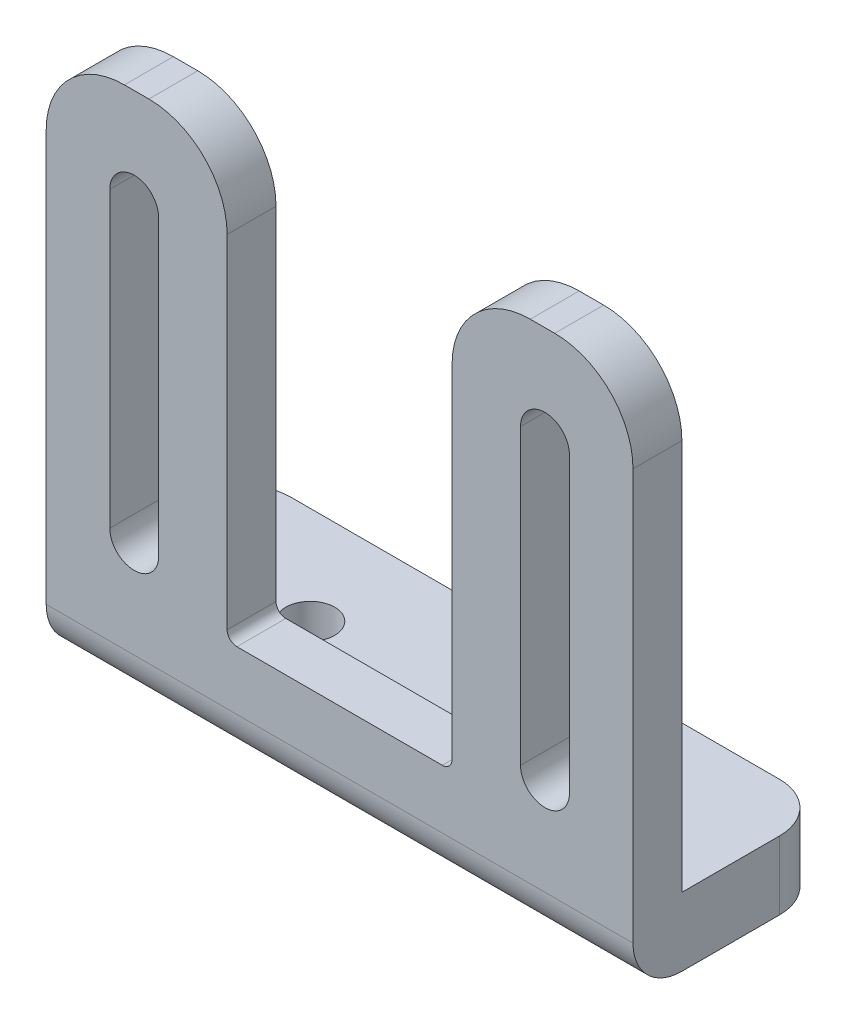
ISO-10303-21;
HEADER;
FILE_DESCRIPTION(('STEP AP214'),'2;1');
FILE_NAME('part.step','',(''),(''),'','','');
FILE_SCHEMA(('AUTOMOTIVE_DESIGN { 1 0 10303 214 1 1 1 1 }'));
ENDSEC;
DATA;
#1=APPLICATION_CONTEXT('core data for automotive mechanical design processes');
#2=APPLICATION_PROTOCOL_DEFINITION('international standard','automotive_design',2000,#1);
#3=PRODUCT_CONTEXT('',#1,'mechanical');
#4=PRODUCT('Part','Part','',(#3));
#5=PRODUCT_RELATED_PRODUCT_CATEGORY('part','',(#4));
#6=PRODUCT_DEFINITION_FORMATION('','',#4);
#7=PRODUCT_DEFINITION_CONTEXT('part definition',#1,'design');
#8=PRODUCT_DEFINITION('design','',#6,#7);
#9=PRODUCT_DEFINITION_SHAPE('','',#8);
#10=(LENGTH_UNIT() NAMED_UNIT(*) SI_UNIT(.MILLI.,.METRE.));
#11=(NAMED_UNIT(*) PLANE_ANGLE_UNIT() SI_UNIT($,.RADIAN.));
#12=(NAMED_UNIT(*) SI_UNIT($,.STERADIAN.) SOLID_ANGLE_UNIT());
#13=UNCERTAINTY_MEASURE_WITH_UNIT(LENGTH_MEASURE(1.E-05),#10,'distance_accuracy_value','');
#14=(GEOMETRIC_REPRESENTATION_CONTEXT(3) GLOBAL_UNCERTAINTY_ASSIGNED_CONTEXT((#13)) GLOBAL_UNIT_ASSIGNED_CONTEXT((#10,
#11,#12)) REPRESENTATION_CONTEXT('',''));
#15=CARTESIAN_POINT('',(0.,0.,0.));
#16=DIRECTION('',(0.,0.,1.));
#17=DIRECTION('',(1.,0.,0.));
#18=AXIS2_PLACEMENT_3D('',#15,#16,#17);
#19=CARTESIAN_POINT('',(0.,55.,5.));
#20=DIRECTION('',(0.,-1.,0.));
#21=DIRECTION('',(0.,0.,-1.));
#22=AXIS2_PLACEMENT_3D('',#19,#20,#21);
#23=PLANE('',#22);
#24=DIRECTION('',(-1.,0.,0.));
#25=VECTOR('',#24,1.);
#26=CARTESIAN_POINT('',(0.,55.,5.));
#27=LINE('',#26,#25);
#28=CARTESIAN_POINT('',(10.5,55.,5.));
#29=VERTEX_POINT('',#28);
#30=CARTESIAN_POINT('',(8.,55.,5.));
#31=VERTEX_POINT('',#30);
#32=EDGE_CURVE('E384',#29,#31,#27,.T.);
#33=ORIENTED_EDGE('',*,*,#32,.F.);
#34=DIRECTION('',(0.,0.,1.));
#35=VECTOR('',#34,1.);
#36=CARTESIAN_POINT('',(10.5,55.,5.));
#37=LINE('',#36,#35);
#38=CARTESIAN_POINT('',(10.5,55.,0.));
#39=VERTEX_POINT('',#38);
#40=EDGE_CURVE('E443',#29,#39,#37,.F.);
#41=ORIENTED_EDGE('',*,*,#40,.T.);
#42=DIRECTION('',(-1.,0.,0.));
#43=VECTOR('',#42,1.);
#44=CARTESIAN_POINT('',(0.,55.,0.));
#45=LINE('',#44,#43);
#46=CARTESIAN_POINT('',(8.,55.,0.));
#47=VERTEX_POINT('',#46);
#48=EDGE_CURVE('E246',#39,#47,#45,.T.);
#49=ORIENTED_EDGE('',*,*,#48,.T.);
#50=DIRECTION('',(0.,0.,-1.));
#51=VECTOR('',#50,1.);
#52=CARTESIAN_POINT('',(8.,55.,5.));
#53=LINE('',#52,#51);
#54=EDGE_CURVE('E440',#47,#31,#53,.F.);
#55=ORIENTED_EDGE('',*,*,#54,.T.);
#56=EDGE_LOOP('',(#33,#41,#49,#55));
#57=FACE_BOUND('',#56,.T.);
#58=ADVANCED_FACE('F43',(#57),#23,.F.);
#59=CARTESIAN_POINT('',(0.,0.,5.));
#60=DIRECTION('',(1.,0.,0.));
#61=DIRECTION('',(0.,0.,-1.));
#62=AXIS2_PLACEMENT_3D('',#59,#60,#61);
#63=PLANE('',#62);
#64=DIRECTION('',(0.,0.,-1.));
#65=VECTOR('',#64,1.);
#66=CARTESIAN_POINT('',(0.,0.,5.));
#67=LINE('',#66,#65);
#68=CARTESIAN_POINT('',(0.,0.,0.));
#69=VERTEX_POINT('',#68);
#70=CARTESIAN_POINT('',(0.,0.,-10.));
#71=VERTEX_POINT('',#70);
#72=EDGE_CURVE('E397',#69,#71,#67,.T.);
#73=ORIENTED_EDGE('',*,*,#72,.F.);
#74=CARTESIAN_POINT('',(0.,5.,0.));
#75=DIRECTION('',(1.,0.,0.));
#76=DIRECTION('',(0.,0.,-1.));
#77=AXIS2_PLACEMENT_3D('',#74,#75,#76);
#78=CIRCLE('',#77,5.);
#79=CARTESIAN_POINT('',(0.,5.,5.));
#80=VERTEX_POINT('',#79);
#81=EDGE_CURVE('E490',#69,#80,#78,.F.);
#82=ORIENTED_EDGE('',*,*,#81,.T.);
#83=DIRECTION('',(0.,-1.,0.));
#84=VECTOR('',#83,1.);
#85=CARTESIAN_POINT('',(0.,0.,5.));
#86=LINE('',#85,#84);
#87=CARTESIAN_POINT('',(0.,47.,5.));
#88=VERTEX_POINT('',#87);
#89=EDGE_CURVE('E376',#88,#80,#86,.T.);
#90=ORIENTED_EDGE('',*,*,#89,.F.);
#91=DIRECTION('',(0.,0.,-1.));
#92=VECTOR('',#91,1.);
#93=CARTESIAN_POINT('',(0.,47.,5.));
#94=LINE('',#93,#92);
#95=CARTESIAN_POINT('',(0.,47.,0.));
#96=VERTEX_POINT('',#95);
#97=EDGE_CURVE('E446',#88,#96,#94,.T.);
#98=ORIENTED_EDGE('',*,*,#97,.T.);
#99=DIRECTION('',(0.,-1.,0.));
#100=VECTOR('',#99,1.);
#101=CARTESIAN_POINT('',(0.,0.,0.));
#102=LINE('',#101,#100);
#103=CARTESIAN_POINT('',(0.,7.,0.));
#104=VERTEX_POINT('',#103);
#105=EDGE_CURVE('E247',#96,#104,#102,.T.);
#106=ORIENTED_EDGE('',*,*,#105,.T.);
#107=DIRECTION('',(0.,0.,1.));
#108=VECTOR('',#107,1.);
#109=CARTESIAN_POINT('',(0.,7.,-15.));
#110=LINE('',#109,#108);
#111=CARTESIAN_POINT('',(0.,7.,-10.));
#112=VERTEX_POINT('',#111);
#113=EDGE_CURVE('E235',#112,#104,#110,.T.);
#114=ORIENTED_EDGE('',*,*,#113,.F.);
#115=DIRECTION('',(0.,1.,0.));
#116=VECTOR('',#115,1.);
#117=CARTESIAN_POINT('',(0.,0.,-10.));
#118=LINE('',#117,#116);
#119=EDGE_CURVE('E476',#112,#71,#118,.F.);
#120=ORIENTED_EDGE('',*,*,#119,.T.);
#121=EDGE_LOOP('',(#73,#82,#90,#98,#106,#114,#120));
#122=FACE_BOUND('',#121,.T.);
#123=ADVANCED_FACE('F551',(#122),#63,.F.);
#124=CARTESIAN_POINT('',(0.,0.,5.));
#125=DIRECTION('',(0.,1.,0.));
#126=DIRECTION('',(0.,0.,1.));
#127=AXIS2_PLACEMENT_3D('',#124,#125,#126);
#128=PLANE('',#127);
#129=CARTESIAN_POINT('',(17.,0.,-5.));
#130=DIRECTION('',(0.,1.,0.));
#131=DIRECTION('',(0.,0.,1.));
#132=AXIS2_PLACEMENT_3D('',#129,#130,#131);
#133=CIRCLE('',#132,2.5);
#134=CARTESIAN_POINT('',(17.,0.,-2.5));
#135=VERTEX_POINT('',#134);
#136=EDGE_CURVE('E254',#135,#135,#133,.F.);
#137=ORIENTED_EDGE('',*,*,#136,.F.);
#138=EDGE_LOOP('',(#137));
#139=FACE_BOUND('',#138,.T.);
#140=CARTESIAN_POINT('',(43.,0.,-5.));
#141=DIRECTION('',(0.,1.,0.));
#142=DIRECTION('',(0.,0.,1.));
#143=AXIS2_PLACEMENT_3D('',#140,#141,#142);
#144=CIRCLE('',#143,2.5);
#145=CARTESIAN_POINT('',(43.,0.,-2.5));
#146=VERTEX_POINT('',#145);
#147=EDGE_CURVE('E949',#146,#146,#144,.F.);
#148=ORIENTED_EDGE('',*,*,#147,.F.);
#149=EDGE_LOOP('',(#148));
#150=FACE_BOUND('',#149,.T.);
#151=DIRECTION('',(0.,0.,-1.));
#152=VECTOR('',#151,1.);
#153=CARTESIAN_POINT('',(60.,0.,5.));
#154=LINE('',#153,#152);
#155=CARTESIAN_POINT('',(60.,0.,0.));
#156=VERTEX_POINT('',#155);
#157=CARTESIAN_POINT('',(60.,0.,-10.));
#158=VERTEX_POINT('',#157);
#159=EDGE_CURVE('E394',#156,#158,#154,.T.);
#160=ORIENTED_EDGE('',*,*,#159,.F.);
#161=DIRECTION('',(1.,0.,0.));
#162=VECTOR('',#161,1.);
#163=CARTESIAN_POINT('',(0.,0.,0.));
#164=LINE('',#163,#162);
#165=EDGE_CURVE('E487',#156,#69,#164,.F.);
#166=ORIENTED_EDGE('',*,*,#165,.T.);
#167=ORIENTED_EDGE('',*,*,#72,.T.);
#168=CARTESIAN_POINT('',(5.,0.,-10.));
#169=DIRECTION('',(0.,1.,0.));
#170=DIRECTION('',(0.,0.,1.));
#171=AXIS2_PLACEMENT_3D('',#168,#169,#170);
#172=CIRCLE('',#171,5.);
#173=CARTESIAN_POINT('',(5.,0.,-15.));
#174=VERTEX_POINT('',#173);
#175=EDGE_CURVE('E461',#71,#174,#172,.F.);
#176=ORIENTED_EDGE('',*,*,#175,.T.);
#177=DIRECTION('',(-1.,0.,0.));
#178=VECTOR('',#177,1.);
#179=CARTESIAN_POINT('',(0.,0.,-15.));
#180=LINE('',#179,#178);
#181=CARTESIAN_POINT('',(55.,0.,-15.));
#182=VERTEX_POINT('',#181);
#183=EDGE_CURVE('E236',#182,#174,#180,.T.);
#184=ORIENTED_EDGE('',*,*,#183,.F.);
#185=CARTESIAN_POINT('',(55.,0.,-10.));
#186=DIRECTION('',(0.,1.,0.));
#187=DIRECTION('',(0.,0.,1.));
#188=AXIS2_PLACEMENT_3D('',#185,#186,#187);
#189=CIRCLE('',#188,5.);
#190=EDGE_CURVE('E464',#182,#158,#189,.F.);
#191=ORIENTED_EDGE('',*,*,#190,.T.);
#192=EDGE_LOOP('',(#160,#166,#167,#176,#184,#191));
#193=FACE_BOUND('',#192,.T.);
#194=ADVANCED_FACE('F587',(#139,#150,#193),#128,.F.);
#195=CARTESIAN_POINT('',(60.,0.,5.));
#196=DIRECTION('',(-1.,0.,0.));
#197=DIRECTION('',(0.,0.,1.));
#198=AXIS2_PLACEMENT_3D('',#195,#196,#197);
#199=PLANE('',#198);
#200=DIRECTION('',(0.,1.,0.));
#201=VECTOR('',#200,1.);
#202=CARTESIAN_POINT('',(60.,0.,5.));
#203=LINE('',#202,#201);
#204=CARTESIAN_POINT('',(60.,5.,5.));
#205=VERTEX_POINT('',#204);
#206=CARTESIAN_POINT('',(60.,47.,5.));
#207=VERTEX_POINT('',#206);
#208=EDGE_CURVE('E380',#205,#207,#203,.T.);
#209=ORIENTED_EDGE('',*,*,#208,.F.);
#210=CARTESIAN_POINT('',(60.,5.,0.));
#211=DIRECTION('',(-1.,0.,0.));
#212=DIRECTION('',(0.,0.,1.));
#213=AXIS2_PLACEMENT_3D('',#210,#211,#212);
#214=CIRCLE('',#213,5.);
#215=EDGE_CURVE('E484',#205,#156,#214,.F.);
#216=ORIENTED_EDGE('',*,*,#215,.T.);
#217=ORIENTED_EDGE('',*,*,#159,.T.);
#218=DIRECTION('',(0.,-1.,0.));
#219=VECTOR('',#218,1.);
#220=CARTESIAN_POINT('',(60.,6.99999999999999,-10.));
#221=LINE('',#220,#219);
#222=CARTESIAN_POINT('',(60.,6.99999999999999,-10.));
#223=VERTEX_POINT('',#222);
#224=EDGE_CURVE('E230',#158,#223,#221,.F.);
#225=ORIENTED_EDGE('',*,*,#224,.T.);
#226=DIRECTION('',(0.,0.,1.));
#227=VECTOR('',#226,1.);
#228=CARTESIAN_POINT('',(60.,6.99999999999999,-15.));
#229=LINE('',#228,#227);
#230=CARTESIAN_POINT('',(60.,6.99999999999999,0.));
#231=VERTEX_POINT('',#230);
#232=EDGE_CURVE('E222',#223,#231,#229,.T.);
#233=ORIENTED_EDGE('',*,*,#232,.T.);
#234=DIRECTION('',(0.,1.,0.));
#235=VECTOR('',#234,1.);
#236=CARTESIAN_POINT('',(60.,0.,0.));
#237=LINE('',#236,#235);
#238=CARTESIAN_POINT('',(60.,47.,0.));
#239=VERTEX_POINT('',#238);
#240=EDGE_CURVE('E227',#231,#239,#237,.T.);
#241=ORIENTED_EDGE('',*,*,#240,.T.);
#242=DIRECTION('',(0.,0.,-1.));
#243=VECTOR('',#242,1.);
#244=CARTESIAN_POINT('',(60.,47.,5.));
#245=LINE('',#244,#243);
#246=EDGE_CURVE('E450',#239,#207,#245,.F.);
#247=ORIENTED_EDGE('',*,*,#246,.T.);
#248=EDGE_LOOP('',(#209,#216,#217,#225,#233,#241,#247));
#249=FACE_BOUND('',#248,.T.);
#250=ADVANCED_FACE('F225',(#249),#199,.F.);
#251=CARTESIAN_POINT('',(52.,55.,0.));
#252=VERTEX_POINT('',#251);
#253=CARTESIAN_POINT('',(49.5,55.,0.));
#254=VERTEX_POINT('',#253);
#255=EDGE_CURVE('E381',#252,#254,#45,.T.);
#256=ORIENTED_EDGE('',*,*,#255,.T.);
#257=DIRECTION('',(0.,0.,1.));
#258=VECTOR('',#257,1.);
#259=CARTESIAN_POINT('',(49.5,55.,5.));
#260=LINE('',#259,#258);
#261=CARTESIAN_POINT('',(49.5,55.,5.));
#262=VERTEX_POINT('',#261);
#263=EDGE_CURVE('E404',#254,#262,#260,.T.);
#264=ORIENTED_EDGE('',*,*,#263,.T.);
#265=CARTESIAN_POINT('',(52.,55.,5.));
#266=VERTEX_POINT('',#265);
#267=EDGE_CURVE('E388',#266,#262,#27,.T.);
#268=ORIENTED_EDGE('',*,*,#267,.F.);
#269=DIRECTION('',(0.,0.,-1.));
#270=VECTOR('',#269,1.);
#271=CARTESIAN_POINT('',(52.,55.,5.));
#272=LINE('',#271,#270);
#273=EDGE_CURVE('E400',#266,#252,#272,.T.);
#274=ORIENTED_EDGE('',*,*,#273,.T.);
#275=EDGE_LOOP('',(#256,#264,#268,#274));
#276=FACE_BOUND('',#275,.T.);
#277=ADVANCED_FACE('F528',(#276),#23,.F.);
#278=CARTESIAN_POINT('',(0.,0.,5.));
#279=DIRECTION('',(0.,0.,-1.));
#280=DIRECTION('',(-1.,0.,0.));
#281=AXIS2_PLACEMENT_3D('',#278,#279,#280);
#282=PLANE('',#281);
#283=DIRECTION('',(0.,-1.,0.));
#284=VECTOR('',#283,1.);
#285=CARTESIAN_POINT('',(6.5,45.,5.));
#286=LINE('',#285,#284);
#287=CARTESIAN_POINT('',(6.5,45.,5.));
#288=VERTEX_POINT('',#287);
#289=CARTESIAN_POINT('',(6.5,15.,5.));
#290=VERTEX_POINT('',#289);
#291=EDGE_CURVE('E284',#288,#290,#286,.T.);
#292=ORIENTED_EDGE('',*,*,#291,.F.);
#293=CARTESIAN_POINT('',(9.,45.,5.));
#294=DIRECTION('',(0.,0.,1.));
#295=DIRECTION('',(1.,0.,0.));
#296=AXIS2_PLACEMENT_3D('',#293,#294,#295);
#297=CIRCLE('',#296,2.5);
#298=CARTESIAN_POINT('',(11.5,45.,5.));
#299=VERTEX_POINT('',#298);
#300=EDGE_CURVE('E281',#299,#288,#297,.T.);
#301=ORIENTED_EDGE('',*,*,#300,.F.);
#302=DIRECTION('',(0.,1.,0.));
#303=VECTOR('',#302,1.);
#304=CARTESIAN_POINT('',(11.5,45.,5.));
#305=LINE('',#304,#303);
#306=CARTESIAN_POINT('',(11.5,15.,5.));
#307=VERTEX_POINT('',#306);
#308=EDGE_CURVE('E292',#307,#299,#305,.T.);
#309=ORIENTED_EDGE('',*,*,#308,.F.);
#310=CARTESIAN_POINT('',(9.,15.,5.));
#311=DIRECTION('',(0.,0.,1.));
#312=DIRECTION('',(1.,0.,0.));
#313=AXIS2_PLACEMENT_3D('',#310,#311,#312);
#314=CIRCLE('',#313,2.5);
#315=EDGE_CURVE('E288',#290,#307,#314,.T.);
#316=ORIENTED_EDGE('',*,*,#315,.F.);
#317=EDGE_LOOP('',(#292,#301,#309,#316));
#318=FACE_BOUND('',#317,.T.);
#319=DIRECTION('',(0.,-1.,0.));
#320=VECTOR('',#319,1.);
#321=CARTESIAN_POINT('',(48.5,45.,5.));
#322=LINE('',#321,#320);
#323=CARTESIAN_POINT('',(48.5,45.,5.));
#324=VERTEX_POINT('',#323);
#325=CARTESIAN_POINT('',(48.5,15.,5.));
#326=VERTEX_POINT('',#325);
#327=EDGE_CURVE('E339',#324,#326,#322,.T.);
#328=ORIENTED_EDGE('',*,*,#327,.F.);
#329=CARTESIAN_POINT('',(51.,45.,5.));
#330=DIRECTION('',(0.,0.,1.));
#331=DIRECTION('',(1.,0.,0.));
#332=AXIS2_PLACEMENT_3D('',#329,#330,#331);
#333=CIRCLE('',#332,2.5);
#334=CARTESIAN_POINT('',(53.5,45.,5.));
#335=VERTEX_POINT('',#334);
#336=EDGE_CURVE('E343',#335,#324,#333,.T.);
#337=ORIENTED_EDGE('',*,*,#336,.F.);
#338=DIRECTION('',(0.,1.,0.));
#339=VECTOR('',#338,1.);
#340=CARTESIAN_POINT('',(53.5,45.,5.));
#341=LINE('',#340,#339);
#342=CARTESIAN_POINT('',(53.5,15.,5.));
#343=VERTEX_POINT('',#342);
#344=EDGE_CURVE('E323',#343,#335,#341,.T.);
#345=ORIENTED_EDGE('',*,*,#344,.F.);
#346=CARTESIAN_POINT('',(51.,15.,5.));
#347=DIRECTION('',(0.,0.,1.));
#348=DIRECTION('',(1.,0.,0.));
#349=AXIS2_PLACEMENT_3D('',#346,#347,#348);
#350=CIRCLE('',#349,2.50000000000001);
#351=EDGE_CURVE('E335',#326,#343,#350,.T.);
#352=ORIENTED_EDGE('',*,*,#351,.F.);
#353=EDGE_LOOP('',(#328,#337,#345,#352));
#354=FACE_BOUND('',#353,.T.);
#355=ORIENTED_EDGE('',*,*,#89,.T.);
#356=DIRECTION('',(1.,0.,0.));
#357=VECTOR('',#356,1.);
#358=CARTESIAN_POINT('',(0.,5.,5.));
#359=LINE('',#358,#357);
#360=EDGE_CURVE('E480',#80,#205,#359,.T.);
#361=ORIENTED_EDGE('',*,*,#360,.T.);
#362=ORIENTED_EDGE('',*,*,#208,.T.);
#363=CARTESIAN_POINT('',(52.,47.,5.));
#364=DIRECTION('',(0.,0.,-1.));
#365=DIRECTION('',(-1.,0.,0.));
#366=AXIS2_PLACEMENT_3D('',#363,#364,#365);
#367=CIRCLE('',#366,8.);
#368=EDGE_CURVE('E408',#207,#266,#367,.F.);
#369=ORIENTED_EDGE('',*,*,#368,.T.);
#370=ORIENTED_EDGE('',*,*,#267,.T.);
#371=CARTESIAN_POINT('',(49.5,47.,5.));
#372=DIRECTION('',(0.,0.,-1.));
#373=DIRECTION('',(-1.,0.,0.));
#374=AXIS2_PLACEMENT_3D('',#371,#372,#373);
#375=CIRCLE('',#374,8.);
#376=CARTESIAN_POINT('',(41.5,47.,5.));
#377=VERTEX_POINT('',#376);
#378=EDGE_CURVE('E417',#262,#377,#375,.F.);
#379=ORIENTED_EDGE('',*,*,#378,.T.);
#380=DIRECTION('',(0.,1.,0.));
#381=VECTOR('',#380,1.);
#382=CARTESIAN_POINT('',(41.5,55.,5.));
#383=LINE('',#382,#381);
#384=CARTESIAN_POINT('',(41.5,12.,5.));
#385=VERTEX_POINT('',#384);
#386=EDGE_CURVE('E359',#385,#377,#383,.T.);
#387=ORIENTED_EDGE('',*,*,#386,.F.);
#388=CARTESIAN_POINT('',(40.5,12.,5.));
#389=DIRECTION('',(0.,0.,-1.));
#390=DIRECTION('',(-1.,0.,0.));
#391=AXIS2_PLACEMENT_3D('',#388,#389,#390);
#392=CIRCLE('',#391,1.);
#393=CARTESIAN_POINT('',(40.5,11.,5.));
#394=VERTEX_POINT('',#393);
#395=EDGE_CURVE('E52',#385,#394,#392,.T.);
#396=ORIENTED_EDGE('',*,*,#395,.T.);
#397=DIRECTION('',(1.,0.,0.));
#398=VECTOR('',#397,1.);
#399=CARTESIAN_POINT('',(18.5,11.,5.));
#400=LINE('',#399,#398);
#401=CARTESIAN_POINT('',(19.5,11.,5.));
#402=VERTEX_POINT('',#401);
#403=EDGE_CURVE('E362',#402,#394,#400,.T.);
#404=ORIENTED_EDGE('',*,*,#403,.F.);
#405=CARTESIAN_POINT('',(19.5,12.,5.));
#406=DIRECTION('',(0.,0.,-1.));
#407=DIRECTION('',(-1.,0.,0.));
#408=AXIS2_PLACEMENT_3D('',#405,#406,#407);
#409=CIRCLE('',#408,1.);
#410=CARTESIAN_POINT('',(18.5,12.,5.));
#411=VERTEX_POINT('',#410);
#412=EDGE_CURVE('E506',#402,#411,#409,.T.);
#413=ORIENTED_EDGE('',*,*,#412,.T.);
#414=DIRECTION('',(0.,-1.,0.));
#415=VECTOR('',#414,1.);
#416=CARTESIAN_POINT('',(18.5,55.,5.));
#417=LINE('',#416,#415);
#418=CARTESIAN_POINT('',(18.5,47.,5.));
#419=VERTEX_POINT('',#418);
#420=EDGE_CURVE('E366',#419,#411,#417,.T.);
#421=ORIENTED_EDGE('',*,*,#420,.F.);
#422=CARTESIAN_POINT('',(10.5,47.,5.));
#423=DIRECTION('',(0.,0.,-1.));
#424=DIRECTION('',(-1.,0.,0.));
#425=AXIS2_PLACEMENT_3D('',#422,#423,#424);
#426=CIRCLE('',#425,8.);
#427=EDGE_CURVE('E414',#419,#29,#426,.F.);
#428=ORIENTED_EDGE('',*,*,#427,.T.);
#429=ORIENTED_EDGE('',*,*,#32,.T.);
#430=CARTESIAN_POINT('',(8.,47.,5.));
#431=DIRECTION('',(0.,0.,-1.));
#432=DIRECTION('',(-1.,0.,0.));
#433=AXIS2_PLACEMENT_3D('',#430,#431,#432);
#434=CIRCLE('',#433,8.);
#435=EDGE_CURVE('E411',#31,#88,#434,.F.);
#436=ORIENTED_EDGE('',*,*,#435,.T.);
#437=EDGE_LOOP('',(#355,#361,#362,#369,#370,#379,#387,#396,#404,#413,#421,#428,#429,#436));
#438=FACE_BOUND('',#437,.T.);
#439=ADVANCED_FACE('F515',(#318,#354,#438),#282,.F.);
#440=CARTESIAN_POINT('',(0.,0.,0.));
#441=DIRECTION('',(0.,0.,-1.));
#442=DIRECTION('',(-1.,0.,0.));
#443=AXIS2_PLACEMENT_3D('',#440,#441,#442);
#444=PLANE('',#443);
#445=DIRECTION('',(1.,0.,0.));
#446=VECTOR('',#445,1.);
#447=CARTESIAN_POINT('',(18.5,11.,0.));
#448=LINE('',#447,#446);
#449=CARTESIAN_POINT('',(19.5,11.,0.));
#450=VERTEX_POINT('',#449);
#451=CARTESIAN_POINT('',(40.5,11.,0.));
#452=VERTEX_POINT('',#451);
#453=EDGE_CURVE('E267',#450,#452,#448,.T.);
#454=ORIENTED_EDGE('',*,*,#453,.T.);
#455=CARTESIAN_POINT('',(40.5,12.,0.));
#456=DIRECTION('',(0.,0.,-1.));
#457=DIRECTION('',(-1.,0.,0.));
#458=AXIS2_PLACEMENT_3D('',#455,#456,#457);
#459=CIRCLE('',#458,1.);
#460=CARTESIAN_POINT('',(41.5,12.,0.));
#461=VERTEX_POINT('',#460);
#462=EDGE_CURVE('E11',#452,#461,#459,.F.);
#463=ORIENTED_EDGE('',*,*,#462,.T.);
#464=DIRECTION('',(0.,1.,0.));
#465=VECTOR('',#464,1.);
#466=CARTESIAN_POINT('',(41.5,55.,0.));
#467=LINE('',#466,#465);
#468=CARTESIAN_POINT('',(41.5,47.,0.));
#469=VERTEX_POINT('',#468);
#470=EDGE_CURVE('E318',#461,#469,#467,.T.);
#471=ORIENTED_EDGE('',*,*,#470,.T.);
#472=CARTESIAN_POINT('',(49.5,47.,0.));
#473=DIRECTION('',(0.,0.,-1.));
#474=DIRECTION('',(-1.,0.,0.));
#475=AXIS2_PLACEMENT_3D('',#472,#473,#474);
#476=CIRCLE('',#475,8.);
#477=EDGE_CURVE('E433',#469,#254,#476,.T.);
#478=ORIENTED_EDGE('',*,*,#477,.T.);
#479=ORIENTED_EDGE('',*,*,#255,.F.);
#480=CARTESIAN_POINT('',(52.,47.,0.));
#481=DIRECTION('',(0.,0.,-1.));
#482=DIRECTION('',(-1.,0.,0.));
#483=AXIS2_PLACEMENT_3D('',#480,#481,#482);
#484=CIRCLE('',#483,8.);
#485=EDGE_CURVE('E244',#252,#239,#484,.T.);
#486=ORIENTED_EDGE('',*,*,#485,.T.);
#487=ORIENTED_EDGE('',*,*,#240,.F.);
#488=DIRECTION('',(1.,0.,0.));
#489=VECTOR('',#488,1.);
#490=CARTESIAN_POINT('',(0.,7.,0.));
#491=LINE('',#490,#489);
#492=EDGE_CURVE('E242',#104,#231,#491,.T.);
#493=ORIENTED_EDGE('',*,*,#492,.F.);
#494=ORIENTED_EDGE('',*,*,#105,.F.);
#495=CARTESIAN_POINT('',(8.,47.,0.));
#496=DIRECTION('',(0.,0.,-1.));
#497=DIRECTION('',(-1.,0.,0.));
#498=AXIS2_PLACEMENT_3D('',#495,#496,#497);
#499=CIRCLE('',#498,8.);
#500=EDGE_CURVE('E427',#96,#47,#499,.T.);
#501=ORIENTED_EDGE('',*,*,#500,.T.);
#502=ORIENTED_EDGE('',*,*,#48,.F.);
#503=CARTESIAN_POINT('',(10.5,47.,0.));
#504=DIRECTION('',(0.,0.,-1.));
#505=DIRECTION('',(-1.,0.,0.));
#506=AXIS2_PLACEMENT_3D('',#503,#504,#505);
#507=CIRCLE('',#506,8.);
#508=CARTESIAN_POINT('',(18.5,47.,0.));
#509=VERTEX_POINT('',#508);
#510=EDGE_CURVE('E430',#39,#509,#507,.T.);
#511=ORIENTED_EDGE('',*,*,#510,.T.);
#512=DIRECTION('',(0.,-1.,0.));
#513=VECTOR('',#512,1.);
#514=CARTESIAN_POINT('',(18.5,55.,0.));
#515=LINE('',#514,#513);
#516=CARTESIAN_POINT('',(18.5,12.,0.));
#517=VERTEX_POINT('',#516);
#518=EDGE_CURVE('E370',#509,#517,#515,.T.);
#519=ORIENTED_EDGE('',*,*,#518,.T.);
#520=CARTESIAN_POINT('',(19.5,12.,0.));
#521=DIRECTION('',(0.,0.,-1.));
#522=DIRECTION('',(-1.,0.,0.));
#523=AXIS2_PLACEMENT_3D('',#520,#521,#522);
#524=CIRCLE('',#523,1.);
#525=EDGE_CURVE('E509',#517,#450,#524,.F.);
#526=ORIENTED_EDGE('',*,*,#525,.T.);
#527=EDGE_LOOP('',(#454,#463,#471,#478,#479,#486,#487,#493,#494,#501,#502,#511,#519,#526));
#528=FACE_BOUND('',#527,.T.);
#529=CARTESIAN_POINT('',(9.,45.,0.));
#530=DIRECTION('',(0.,0.,-1.));
#531=DIRECTION('',(-1.,0.,0.));
#532=AXIS2_PLACEMENT_3D('',#529,#530,#531);
#533=CIRCLE('',#532,2.5);
#534=CARTESIAN_POINT('',(11.5,45.,0.));
#535=VERTEX_POINT('',#534);
#536=CARTESIAN_POINT('',(6.5,45.,0.));
#537=VERTEX_POINT('',#536);
#538=EDGE_CURVE('E277',#535,#537,#533,.F.);
#539=ORIENTED_EDGE('',*,*,#538,.T.);
#540=DIRECTION('',(0.,-1.,0.));
#541=VECTOR('',#540,1.);
#542=CARTESIAN_POINT('',(6.5,45.,0.));
#543=LINE('',#542,#541);
#544=CARTESIAN_POINT('',(6.5,15.,0.));
#545=VERTEX_POINT('',#544);
#546=EDGE_CURVE('E300',#537,#545,#543,.T.);
#547=ORIENTED_EDGE('',*,*,#546,.T.);
#548=CARTESIAN_POINT('',(9.,15.,0.));
#549=DIRECTION('',(0.,0.,-1.));
#550=DIRECTION('',(-1.,0.,0.));
#551=AXIS2_PLACEMENT_3D('',#548,#549,#550);
#552=CIRCLE('',#551,2.5);
#553=CARTESIAN_POINT('',(11.5,15.,0.));
#554=VERTEX_POINT('',#553);
#555=EDGE_CURVE('E268',#545,#554,#552,.F.);
#556=ORIENTED_EDGE('',*,*,#555,.T.);
#557=DIRECTION('',(0.,1.,0.));
#558=VECTOR('',#557,1.);
#559=CARTESIAN_POINT('',(11.5,45.,0.));
#560=LINE('',#559,#558);
#561=EDGE_CURVE('E272',#554,#535,#560,.T.);
#562=ORIENTED_EDGE('',*,*,#561,.T.);
#563=EDGE_LOOP('',(#539,#547,#556,#562));
#564=FACE_BOUND('',#563,.T.);
#565=CARTESIAN_POINT('',(51.,45.,0.));
#566=DIRECTION('',(0.,0.,-1.));
#567=DIRECTION('',(-1.,0.,0.));
#568=AXIS2_PLACEMENT_3D('',#565,#566,#567);
#569=CIRCLE('',#568,2.5);
#570=CARTESIAN_POINT('',(53.5,45.,0.));
#571=VERTEX_POINT('',#570);
#572=CARTESIAN_POINT('',(48.5,45.,0.));
#573=VERTEX_POINT('',#572);
#574=EDGE_CURVE('E346',#571,#573,#569,.F.);
#575=ORIENTED_EDGE('',*,*,#574,.T.);
#576=DIRECTION('',(0.,-1.,0.));
#577=VECTOR('',#576,1.);
#578=CARTESIAN_POINT('',(48.5,45.,0.));
#579=LINE('',#578,#577);
#580=CARTESIAN_POINT('',(48.5,15.,0.));
#581=VERTEX_POINT('',#580);
#582=EDGE_CURVE('E313',#573,#581,#579,.T.);
#583=ORIENTED_EDGE('',*,*,#582,.T.);
#584=CARTESIAN_POINT('',(51.,15.,0.));
#585=DIRECTION('',(0.,0.,-1.));
#586=DIRECTION('',(-1.,0.,0.));
#587=AXIS2_PLACEMENT_3D('',#584,#585,#586);
#588=CIRCLE('',#587,2.50000000000001);
#589=CARTESIAN_POINT('',(53.5,15.,0.));
#590=VERTEX_POINT('',#589);
#591=EDGE_CURVE('E273',#581,#590,#588,.F.);
#592=ORIENTED_EDGE('',*,*,#591,.T.);
#593=DIRECTION('',(0.,1.,0.));
#594=VECTOR('',#593,1.);
#595=CARTESIAN_POINT('',(53.5,45.,0.));
#596=LINE('',#595,#594);
#597=EDGE_CURVE('E350',#590,#571,#596,.T.);
#598=ORIENTED_EDGE('',*,*,#597,.T.);
#599=EDGE_LOOP('',(#575,#583,#592,#598));
#600=FACE_BOUND('',#599,.T.);
#601=ADVANCED_FACE('F239',(#528,#564,#600),#444,.T.);
#602=CARTESIAN_POINT('',(18.5,55.,-0.00100000000000013));
#603=DIRECTION('',(-1.,0.,0.));
#604=DIRECTION('',(0.,-1.,0.));
#605=AXIS2_PLACEMENT_3D('',#602,#603,#604);
#606=PLANE('',#605);
#607=ORIENTED_EDGE('',*,*,#420,.T.);
#608=DIRECTION('',(0.,0.,1.));
#609=VECTOR('',#608,1.);
#610=CARTESIAN_POINT('',(18.5,12.,0.));
#611=LINE('',#610,#609);
#612=EDGE_CURVE('E500',#411,#517,#611,.F.);
#613=ORIENTED_EDGE('',*,*,#612,.T.);
#614=ORIENTED_EDGE('',*,*,#518,.F.);
#615=DIRECTION('',(0.,0.,1.));
#616=VECTOR('',#615,1.);
#617=CARTESIAN_POINT('',(18.5,47.,-0.00100000000000013));
#618=LINE('',#617,#616);
#619=EDGE_CURVE('E436',#509,#419,#618,.T.);
#620=ORIENTED_EDGE('',*,*,#619,.T.);
#621=EDGE_LOOP('',(#607,#613,#614,#620));
#622=FACE_BOUND('',#621,.T.);
#623=ADVANCED_FACE('F615',(#622),#606,.F.);
#624=CARTESIAN_POINT('',(41.5,55.,-0.00100000000000013));
#625=DIRECTION('',(1.,0.,0.));
#626=DIRECTION('',(0.,1.,0.));
#627=AXIS2_PLACEMENT_3D('',#624,#625,#626);
#628=PLANE('',#627);
#629=ORIENTED_EDGE('',*,*,#470,.F.);
#630=DIRECTION('',(0.,0.,1.));
#631=VECTOR('',#630,1.);
#632=CARTESIAN_POINT('',(41.5,12.,5.));
#633=LINE('',#632,#631);
#634=EDGE_CURVE('E503',#461,#385,#633,.T.);
#635=ORIENTED_EDGE('',*,*,#634,.T.);
#636=ORIENTED_EDGE('',*,*,#386,.T.);
#637=DIRECTION('',(0.,0.,1.));
#638=VECTOR('',#637,1.);
#639=CARTESIAN_POINT('',(41.5,47.,-0.00100000000000013));
#640=LINE('',#639,#638);
#641=EDGE_CURVE('E421',#377,#469,#640,.F.);
#642=ORIENTED_EDGE('',*,*,#641,.T.);
#643=EDGE_LOOP('',(#629,#635,#636,#642));
#644=FACE_BOUND('',#643,.T.);
#645=ADVANCED_FACE('F521',(#644),#628,.F.);
#646=CARTESIAN_POINT('',(18.5,11.,-0.00100000000000013));
#647=DIRECTION('',(0.,-1.,0.));
#648=DIRECTION('',(0.,0.,-1.));
#649=AXIS2_PLACEMENT_3D('',#646,#647,#648);
#650=PLANE('',#649);
#651=ORIENTED_EDGE('',*,*,#453,.F.);
#652=DIRECTION('',(0.,0.,1.));
#653=VECTOR('',#652,1.);
#654=CARTESIAN_POINT('',(19.5,11.,5.));
#655=LINE('',#654,#653);
#656=EDGE_CURVE('E496',#450,#402,#655,.T.);
#657=ORIENTED_EDGE('',*,*,#656,.T.);
#658=ORIENTED_EDGE('',*,*,#403,.T.);
#659=DIRECTION('',(0.,0.,1.));
#660=VECTOR('',#659,1.);
#661=CARTESIAN_POINT('',(40.5,11.,0.));
#662=LINE('',#661,#660);
#663=EDGE_CURVE('E493',#394,#452,#662,.F.);
#664=ORIENTED_EDGE('',*,*,#663,.T.);
#665=EDGE_LOOP('',(#651,#657,#658,#664));
#666=FACE_BOUND('',#665,.T.);
#667=ADVANCED_FACE('F518',(#666),#650,.F.);
#668=CARTESIAN_POINT('',(51.,45.,-0.00100000000000013));
#669=DIRECTION('',(0.,0.,1.));
#670=DIRECTION('',(1.,0.,0.));
#671=AXIS2_PLACEMENT_3D('',#668,#669,#670);
#672=CYLINDRICAL_SURFACE('',#671,2.5);
#673=DIRECTION('',(0.,0.,1.));
#674=VECTOR('',#673,1.);
#675=CARTESIAN_POINT('',(53.5,45.,-0.00100000000000013));
#676=LINE('',#675,#674);
#677=EDGE_CURVE('E317',#571,#335,#676,.T.);
#678=ORIENTED_EDGE('',*,*,#677,.T.);
#679=ORIENTED_EDGE('',*,*,#336,.T.);
#680=DIRECTION('',(0.,0.,1.));
#681=VECTOR('',#680,1.);
#682=CARTESIAN_POINT('',(48.5,45.,-0.00100000000000013));
#683=LINE('',#682,#681);
#684=EDGE_CURVE('E319',#573,#324,#683,.T.);
#685=ORIENTED_EDGE('',*,*,#684,.F.);
#686=ORIENTED_EDGE('',*,*,#574,.F.);
#687=EDGE_LOOP('',(#678,#679,#685,#686));
#688=FACE_BOUND('',#687,.T.);
#689=ADVANCED_FACE('F685',(#688),#672,.F.);
#690=CARTESIAN_POINT('',(53.5,45.,-0.00100000000000013));
#691=DIRECTION('',(1.,0.,0.));
#692=DIRECTION('',(0.,1.,0.));
#693=AXIS2_PLACEMENT_3D('',#690,#691,#692);
#694=PLANE('',#693);
#695=DIRECTION('',(0.,0.,1.));
#696=VECTOR('',#695,1.);
#697=CARTESIAN_POINT('',(53.5,15.,-0.00100000000000013));
#698=LINE('',#697,#696);
#699=EDGE_CURVE('E327',#590,#343,#698,.T.);
#700=ORIENTED_EDGE('',*,*,#699,.T.);
#701=ORIENTED_EDGE('',*,*,#344,.T.);
#702=ORIENTED_EDGE('',*,*,#677,.F.);
#703=ORIENTED_EDGE('',*,*,#597,.F.);
#704=EDGE_LOOP('',(#700,#701,#702,#703));
#705=FACE_BOUND('',#704,.T.);
#706=ADVANCED_FACE('F831',(#705),#694,.F.);
#707=CARTESIAN_POINT('',(51.,15.,-0.00100000000000013));
#708=DIRECTION('',(0.,0.,1.));
#709=DIRECTION('',(1.,0.,0.));
#710=AXIS2_PLACEMENT_3D('',#707,#708,#709);
#711=CYLINDRICAL_SURFACE('',#710,2.50000000000001);
#712=DIRECTION('',(0.,0.,1.));
#713=VECTOR('',#712,1.);
#714=CARTESIAN_POINT('',(48.5,15.,-0.00100000000000013));
#715=LINE('',#714,#713);
#716=EDGE_CURVE('E324',#581,#326,#715,.T.);
#717=ORIENTED_EDGE('',*,*,#716,.T.);
#718=ORIENTED_EDGE('',*,*,#351,.T.);
#719=ORIENTED_EDGE('',*,*,#699,.F.);
#720=ORIENTED_EDGE('',*,*,#591,.F.);
#721=EDGE_LOOP('',(#717,#718,#719,#720));
#722=FACE_BOUND('',#721,.T.);
#723=ADVANCED_FACE('F821',(#722),#711,.F.);
#724=CARTESIAN_POINT('',(48.5,45.,-0.00100000000000013));
#725=DIRECTION('',(-1.,0.,0.));
#726=DIRECTION('',(0.,-1.,0.));
#727=AXIS2_PLACEMENT_3D('',#724,#725,#726);
#728=PLANE('',#727);
#729=ORIENTED_EDGE('',*,*,#684,.T.);
#730=ORIENTED_EDGE('',*,*,#327,.T.);
#731=ORIENTED_EDGE('',*,*,#716,.F.);
#732=ORIENTED_EDGE('',*,*,#582,.F.);
#733=EDGE_LOOP('',(#729,#730,#731,#732));
#734=FACE_BOUND('',#733,.T.);
#735=ADVANCED_FACE('F811',(#734),#728,.F.);
#736=CARTESIAN_POINT('',(9.,45.,-0.00100000000000013));
#737=DIRECTION('',(0.,0.,1.));
#738=DIRECTION('',(1.,0.,0.));
#739=AXIS2_PLACEMENT_3D('',#736,#737,#738);
#740=CYLINDRICAL_SURFACE('',#739,2.5);
#741=DIRECTION('',(0.,0.,1.));
#742=VECTOR('',#741,1.);
#743=CARTESIAN_POINT('',(11.5,45.,-0.00100000000000013));
#744=LINE('',#743,#742);
#745=EDGE_CURVE('E297',#535,#299,#744,.T.);
#746=ORIENTED_EDGE('',*,*,#745,.T.);
#747=ORIENTED_EDGE('',*,*,#300,.T.);
#748=DIRECTION('',(0.,0.,1.));
#749=VECTOR('',#748,1.);
#750=CARTESIAN_POINT('',(6.5,45.,-0.00100000000000013));
#751=LINE('',#750,#749);
#752=EDGE_CURVE('E296',#537,#288,#751,.T.);
#753=ORIENTED_EDGE('',*,*,#752,.F.);
#754=ORIENTED_EDGE('',*,*,#538,.F.);
#755=EDGE_LOOP('',(#746,#747,#753,#754));
#756=FACE_BOUND('',#755,.T.);
#757=ADVANCED_FACE('F801',(#756),#740,.F.);
#758=CARTESIAN_POINT('',(11.5,45.,-0.00100000000000013));
#759=DIRECTION('',(1.,0.,0.));
#760=DIRECTION('',(0.,1.,0.));
#761=AXIS2_PLACEMENT_3D('',#758,#759,#760);
#762=PLANE('',#761);
#763=DIRECTION('',(0.,0.,1.));
#764=VECTOR('',#763,1.);
#765=CARTESIAN_POINT('',(11.5,15.,-0.00100000000000013));
#766=LINE('',#765,#764);
#767=EDGE_CURVE('E301',#554,#307,#766,.T.);
#768=ORIENTED_EDGE('',*,*,#767,.T.);
#769=ORIENTED_EDGE('',*,*,#308,.T.);
#770=ORIENTED_EDGE('',*,*,#745,.F.);
#771=ORIENTED_EDGE('',*,*,#561,.F.);
#772=EDGE_LOOP('',(#768,#769,#770,#771));
#773=FACE_BOUND('',#772,.T.);
#774=ADVANCED_FACE('F791',(#773),#762,.F.);
#775=CARTESIAN_POINT('',(9.,15.,-0.00100000000000013));
#776=DIRECTION('',(0.,0.,1.));
#777=DIRECTION('',(1.,0.,0.));
#778=AXIS2_PLACEMENT_3D('',#775,#776,#777);
#779=CYLINDRICAL_SURFACE('',#778,2.5);
#780=DIRECTION('',(0.,0.,1.));
#781=VECTOR('',#780,1.);
#782=CARTESIAN_POINT('',(6.5,15.,-0.00100000000000013));
#783=LINE('',#782,#781);
#784=EDGE_CURVE('E304',#545,#290,#783,.T.);
#785=ORIENTED_EDGE('',*,*,#784,.T.);
#786=ORIENTED_EDGE('',*,*,#315,.T.);
#787=ORIENTED_EDGE('',*,*,#767,.F.);
#788=ORIENTED_EDGE('',*,*,#555,.F.);
#789=EDGE_LOOP('',(#785,#786,#787,#788));
#790=FACE_BOUND('',#789,.T.);
#791=ADVANCED_FACE('F780',(#790),#779,.F.);
#792=CARTESIAN_POINT('',(6.5,45.,-0.00100000000000013));
#793=DIRECTION('',(-1.,0.,0.));
#794=DIRECTION('',(0.,-1.,0.));
#795=AXIS2_PLACEMENT_3D('',#792,#793,#794);
#796=PLANE('',#795);
#797=ORIENTED_EDGE('',*,*,#752,.T.);
#798=ORIENTED_EDGE('',*,*,#291,.T.);
#799=ORIENTED_EDGE('',*,*,#784,.F.);
#800=ORIENTED_EDGE('',*,*,#546,.F.);
#801=EDGE_LOOP('',(#797,#798,#799,#800));
#802=FACE_BOUND('',#801,.T.);
#803=ADVANCED_FACE('F770',(#802),#796,.F.);
#804=CARTESIAN_POINT('',(0.,7.,-15.));
#805=DIRECTION('',(0.,-1.,0.));
#806=DIRECTION('',(1.,0.,0.));
#807=AXIS2_PLACEMENT_3D('',#804,#805,#806);
#808=PLANE('',#807);
#809=CARTESIAN_POINT('',(17.,7.,-5.));
#810=DIRECTION('',(0.,1.,0.));
#811=DIRECTION('',(-1.,0.,0.));
#812=AXIS2_PLACEMENT_3D('',#809,#810,#811);
#813=CIRCLE('',#812,2.5);
#814=CARTESIAN_POINT('',(14.5,7.,-5.));
#815=VERTEX_POINT('',#814);
#816=EDGE_CURVE('E261',#815,#815,#813,.T.);
#817=ORIENTED_EDGE('',*,*,#816,.F.);
#818=EDGE_LOOP('',(#817));
#819=FACE_BOUND('',#818,.T.);
#820=CARTESIAN_POINT('',(43.,6.99999999999999,-5.));
#821=DIRECTION('',(0.,1.,0.));
#822=DIRECTION('',(-1.,0.,0.));
#823=AXIS2_PLACEMENT_3D('',#820,#821,#822);
#824=CIRCLE('',#823,2.5);
#825=CARTESIAN_POINT('',(40.5,6.99999999999999,-5.));
#826=VERTEX_POINT('',#825);
#827=EDGE_CURVE('E947',#826,#826,#824,.T.);
#828=ORIENTED_EDGE('',*,*,#827,.F.);
#829=EDGE_LOOP('',(#828));
#830=FACE_BOUND('',#829,.T.);
#831=ORIENTED_EDGE('',*,*,#232,.F.);
#832=CARTESIAN_POINT('',(55.,6.99999999999999,-10.));
#833=DIRECTION('',(0.,-1.,0.));
#834=DIRECTION('',(1.,0.,0.));
#835=AXIS2_PLACEMENT_3D('',#832,#833,#834);
#836=CIRCLE('',#835,5.);
#837=CARTESIAN_POINT('',(55.,6.99999999999999,-15.));
#838=VERTEX_POINT('',#837);
#839=EDGE_CURVE('E473',#223,#838,#836,.F.);
#840=ORIENTED_EDGE('',*,*,#839,.T.);
#841=DIRECTION('',(1.,0.,0.));
#842=VECTOR('',#841,1.);
#843=CARTESIAN_POINT('',(0.,7.,-15.));
#844=LINE('',#843,#842);
#845=CARTESIAN_POINT('',(5.,7.,-15.));
#846=VERTEX_POINT('',#845);
#847=EDGE_CURVE('E253',#846,#838,#844,.T.);
#848=ORIENTED_EDGE('',*,*,#847,.F.);
#849=CARTESIAN_POINT('',(5.,7.,-10.));
#850=DIRECTION('',(0.,-1.,0.));
#851=DIRECTION('',(1.,0.,0.));
#852=AXIS2_PLACEMENT_3D('',#849,#850,#851);
#853=CIRCLE('',#852,5.);
#854=EDGE_CURVE('E470',#846,#112,#853,.F.);
#855=ORIENTED_EDGE('',*,*,#854,.T.);
#856=ORIENTED_EDGE('',*,*,#113,.T.);
#857=ORIENTED_EDGE('',*,*,#492,.T.);
#858=EDGE_LOOP('',(#831,#840,#848,#855,#856,#857));
#859=FACE_BOUND('',#858,.T.);
#860=ADVANCED_FACE('F249',(#819,#830,#859),#808,.F.);
#861=CARTESIAN_POINT('',(0.,0.,-15.));
#862=DIRECTION('',(0.,0.,-1.));
#863=DIRECTION('',(-1.,0.,0.));
#864=AXIS2_PLACEMENT_3D('',#861,#862,#863);
#865=PLANE('',#864);
#866=ORIENTED_EDGE('',*,*,#847,.T.);
#867=DIRECTION('',(0.,-1.,0.));
#868=VECTOR('',#867,1.);
#869=CARTESIAN_POINT('',(55.,0.,-15.));
#870=LINE('',#869,#868);
#871=EDGE_CURVE('E457',#838,#182,#870,.T.);
#872=ORIENTED_EDGE('',*,*,#871,.T.);
#873=ORIENTED_EDGE('',*,*,#183,.T.);
#874=DIRECTION('',(0.,1.,0.));
#875=VECTOR('',#874,1.);
#876=CARTESIAN_POINT('',(5.,7.,-15.));
#877=LINE('',#876,#875);
#878=EDGE_CURVE('E453',#174,#846,#877,.T.);
#879=ORIENTED_EDGE('',*,*,#878,.T.);
#880=EDGE_LOOP('',(#866,#872,#873,#879));
#881=FACE_BOUND('',#880,.T.);
#882=ADVANCED_FACE('F541',(#881),#865,.T.);
#883=CARTESIAN_POINT('',(43.,-0.00100000000001228,-5.));
#884=DIRECTION('',(0.,1.,0.));
#885=DIRECTION('',(-1.,0.,0.));
#886=AXIS2_PLACEMENT_3D('',#883,#884,#885);
#887=CYLINDRICAL_SURFACE('',#886,2.5);
#888=ORIENTED_EDGE('',*,*,#827,.T.);
#889=EDGE_LOOP('',(#888));
#890=FACE_BOUND('',#889,.T.);
#891=ORIENTED_EDGE('',*,*,#147,.T.);
#892=EDGE_LOOP('',(#891));
#893=FACE_BOUND('',#892,.T.);
#894=ADVANCED_FACE('F743',(#890,#893),#887,.F.);
#895=CARTESIAN_POINT('',(17.,-0.00100000000000881,-5.));
#896=DIRECTION('',(0.,1.,0.));
#897=DIRECTION('',(-1.,0.,0.));
#898=AXIS2_PLACEMENT_3D('',#895,#896,#897);
#899=CYLINDRICAL_SURFACE('',#898,2.5);
#900=ORIENTED_EDGE('',*,*,#816,.T.);
#901=EDGE_LOOP('',(#900));
#902=FACE_BOUND('',#901,.T.);
#903=ORIENTED_EDGE('',*,*,#136,.T.);
#904=EDGE_LOOP('',(#903));
#905=FACE_BOUND('',#904,.T.);
#906=ADVANCED_FACE('F606',(#902,#905),#899,.F.);
#907=CARTESIAN_POINT('',(49.5,47.,5.));
#908=DIRECTION('',(0.,0.,1.));
#909=DIRECTION('',(1.,0.,0.));
#910=AXIS2_PLACEMENT_3D('',#907,#908,#909);
#911=CYLINDRICAL_SURFACE('',#910,8.);
#912=ORIENTED_EDGE('',*,*,#477,.F.);
#913=ORIENTED_EDGE('',*,*,#641,.F.);
#914=ORIENTED_EDGE('',*,*,#378,.F.);
#915=ORIENTED_EDGE('',*,*,#263,.F.);
#916=EDGE_LOOP('',(#912,#913,#914,#915));
#917=FACE_BOUND('',#916,.T.);
#918=ADVANCED_FACE('F533',(#917),#911,.T.);
#919=CARTESIAN_POINT('',(10.5,47.,-0.00100000000000013));
#920=DIRECTION('',(0.,0.,1.));
#921=DIRECTION('',(1.,0.,0.));
#922=AXIS2_PLACEMENT_3D('',#919,#920,#921);
#923=CYLINDRICAL_SURFACE('',#922,8.);
#924=ORIENTED_EDGE('',*,*,#510,.F.);
#925=ORIENTED_EDGE('',*,*,#40,.F.);
#926=ORIENTED_EDGE('',*,*,#427,.F.);
#927=ORIENTED_EDGE('',*,*,#619,.F.);
#928=EDGE_LOOP('',(#924,#925,#926,#927));
#929=FACE_BOUND('',#928,.T.);
#930=ADVANCED_FACE('F580',(#929),#923,.T.);
#931=CARTESIAN_POINT('',(8.,47.,5.));
#932=DIRECTION('',(0.,0.,-1.));
#933=DIRECTION('',(-1.,0.,0.));
#934=AXIS2_PLACEMENT_3D('',#931,#932,#933);
#935=CYLINDRICAL_SURFACE('',#934,8.);
#936=ORIENTED_EDGE('',*,*,#435,.F.);
#937=ORIENTED_EDGE('',*,*,#54,.F.);
#938=ORIENTED_EDGE('',*,*,#500,.F.);
#939=ORIENTED_EDGE('',*,*,#97,.F.);
#940=EDGE_LOOP('',(#936,#937,#938,#939));
#941=FACE_BOUND('',#940,.T.);
#942=ADVANCED_FACE('F562',(#941),#935,.T.);
#943=CARTESIAN_POINT('',(52.,47.,5.));
#944=DIRECTION('',(0.,0.,-1.));
#945=DIRECTION('',(-1.,0.,0.));
#946=AXIS2_PLACEMENT_3D('',#943,#944,#945);
#947=CYLINDRICAL_SURFACE('',#946,8.);
#948=ORIENTED_EDGE('',*,*,#368,.F.);
#949=ORIENTED_EDGE('',*,*,#246,.F.);
#950=ORIENTED_EDGE('',*,*,#485,.F.);
#951=ORIENTED_EDGE('',*,*,#273,.F.);
#952=EDGE_LOOP('',(#948,#949,#950,#951));
#953=FACE_BOUND('',#952,.T.);
#954=ADVANCED_FACE('F570',(#953),#947,.T.);
#955=CARTESIAN_POINT('',(55.,0.,-10.));
#956=DIRECTION('',(0.,1.,0.));
#957=DIRECTION('',(0.,0.,1.));
#958=AXIS2_PLACEMENT_3D('',#955,#956,#957);
#959=CYLINDRICAL_SURFACE('',#958,5.);
#960=ORIENTED_EDGE('',*,*,#839,.F.);
#961=ORIENTED_EDGE('',*,*,#224,.F.);
#962=ORIENTED_EDGE('',*,*,#190,.F.);
#963=ORIENTED_EDGE('',*,*,#871,.F.);
#964=EDGE_LOOP('',(#960,#961,#962,#963));
#965=FACE_BOUND('',#964,.T.);
#966=ADVANCED_FACE('F572',(#965),#959,.T.);
#967=CARTESIAN_POINT('',(5.,0.,-10.));
#968=DIRECTION('',(0.,-1.,0.));
#969=DIRECTION('',(0.,0.,-1.));
#970=AXIS2_PLACEMENT_3D('',#967,#968,#969);
#971=CYLINDRICAL_SURFACE('',#970,5.);
#972=ORIENTED_EDGE('',*,*,#175,.F.);
#973=ORIENTED_EDGE('',*,*,#119,.F.);
#974=ORIENTED_EDGE('',*,*,#854,.F.);
#975=ORIENTED_EDGE('',*,*,#878,.F.);
#976=EDGE_LOOP('',(#972,#973,#974,#975));
#977=FACE_BOUND('',#976,.T.);
#978=ADVANCED_FACE('F547',(#977),#971,.T.);
#979=CARTESIAN_POINT('',(0.,5.,0.));
#980=DIRECTION('',(1.,0.,0.));
#981=DIRECTION('',(0.,0.,-1.));
#982=AXIS2_PLACEMENT_3D('',#979,#980,#981);
#983=CYLINDRICAL_SURFACE('',#982,5.);
#984=ORIENTED_EDGE('',*,*,#81,.F.);
#985=ORIENTED_EDGE('',*,*,#165,.F.);
#986=ORIENTED_EDGE('',*,*,#215,.F.);
#987=ORIENTED_EDGE('',*,*,#360,.F.);
#988=EDGE_LOOP('',(#984,#985,#986,#987));
#989=FACE_BOUND('',#988,.T.);
#990=ADVANCED_FACE('F567',(#989),#983,.T.);
#991=CARTESIAN_POINT('',(19.5,12.,-0.00100000000000013));
#992=DIRECTION('',(0.,0.,-1.));
#993=DIRECTION('',(-1.,0.,0.));
#994=AXIS2_PLACEMENT_3D('',#991,#992,#993);
#995=CYLINDRICAL_SURFACE('',#994,1.);
#996=ORIENTED_EDGE('',*,*,#525,.F.);
#997=ORIENTED_EDGE('',*,*,#612,.F.);
#998=ORIENTED_EDGE('',*,*,#412,.F.);
#999=ORIENTED_EDGE('',*,*,#656,.F.);
#1000=EDGE_LOOP('',(#996,#997,#998,#999));
#1001=FACE_BOUND('',#1000,.T.);
#1002=ADVANCED_FACE('F619',(#1001),#995,.F.);
#1003=CARTESIAN_POINT('',(40.5,12.,-0.00100000000000013));
#1004=DIRECTION('',(0.,0.,-1.));
#1005=DIRECTION('',(-1.,0.,0.));
#1006=AXIS2_PLACEMENT_3D('',#1003,#1004,#1005);
#1007=CYLINDRICAL_SURFACE('',#1006,1.);
#1008=ORIENTED_EDGE('',*,*,#462,.F.);
#1009=ORIENTED_EDGE('',*,*,#663,.F.);
#1010=ORIENTED_EDGE('',*,*,#395,.F.);
#1011=ORIENTED_EDGE('',*,*,#634,.F.);
#1012=EDGE_LOOP('',(#1008,#1009,#1010,#1011));
#1013=FACE_BOUND('',#1012,.T.);
#1014=ADVANCED_FACE('F45',(#1013),#1007,.F.);
#1015=CLOSED_SHELL('',(#58,#123,#194,#250,#277,#439,#601,#623,#645,#667,#689,#706,#723,#735,
#757,#774,#791,#803,#860,#882,#894,#906,#918,#930,#942,#954,#966,#978,#990,#1002,#1014));
#1016=MANIFOLD_SOLID_BREP('B2',#1015);
#1017=ADVANCED_BREP_SHAPE_REPRESENTATION('',(#18,#1016),#14);
#1018=SHAPE_DEFINITION_REPRESENTATION(#9,#1017);
ENDSEC;
END-ISO-10303-21;
